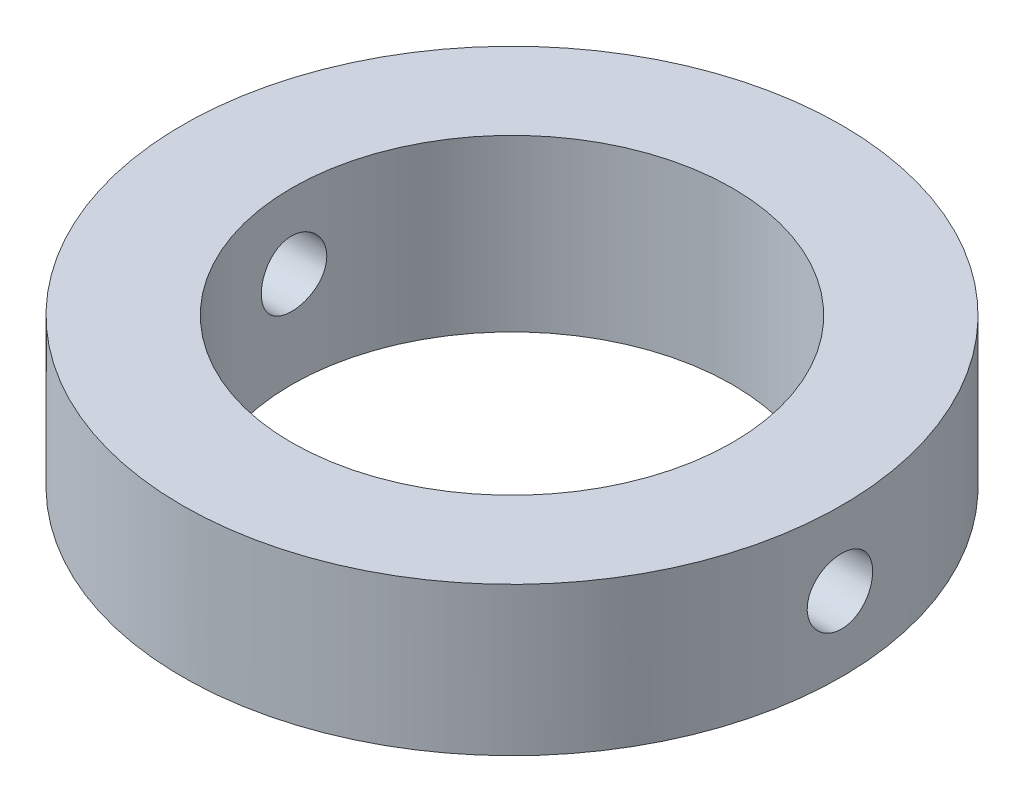
ISO-10303-21;
HEADER;
FILE_DESCRIPTION(('STEP AP214'),'2;1');
FILE_NAME('part.step','',(''),(''),'','','');
FILE_SCHEMA(('AUTOMOTIVE_DESIGN { 1 0 10303 214 1 1 1 1 }'));
ENDSEC;
DATA;
#1=APPLICATION_CONTEXT('core data for automotive mechanical design processes');
#2=APPLICATION_PROTOCOL_DEFINITION('international standard','automotive_design',2000,#1);
#3=PRODUCT_CONTEXT('',#1,'mechanical');
#4=PRODUCT('Part','Part','',(#3));
#5=PRODUCT_RELATED_PRODUCT_CATEGORY('part','',(#4));
#6=PRODUCT_DEFINITION_FORMATION('','',#4);
#7=PRODUCT_DEFINITION_CONTEXT('part definition',#1,'design');
#8=PRODUCT_DEFINITION('design','',#6,#7);
#9=PRODUCT_DEFINITION_SHAPE('','',#8);
#10=(LENGTH_UNIT() NAMED_UNIT(*) SI_UNIT(.MILLI.,.METRE.));
#11=(NAMED_UNIT(*) PLANE_ANGLE_UNIT() SI_UNIT($,.RADIAN.));
#12=(NAMED_UNIT(*) SI_UNIT($,.STERADIAN.) SOLID_ANGLE_UNIT());
#13=UNCERTAINTY_MEASURE_WITH_UNIT(LENGTH_MEASURE(1.E-05),#10,'distance_accuracy_value','');
#14=(GEOMETRIC_REPRESENTATION_CONTEXT(3) GLOBAL_UNCERTAINTY_ASSIGNED_CONTEXT((#13)) GLOBAL_UNIT_ASSIGNED_CONTEXT((#10,
#11,#12)) REPRESENTATION_CONTEXT('',''));
#15=CARTESIAN_POINT('',(0.,0.,0.));
#16=DIRECTION('',(0.,0.,1.));
#17=DIRECTION('',(1.,0.,0.));
#18=AXIS2_PLACEMENT_3D('',#15,#16,#17);
#19=CARTESIAN_POINT('',(0.,0.,0.));
#20=DIRECTION('',(0.,1.,0.));
#21=DIRECTION('',(0.,0.,1.));
#22=AXIS2_PLACEMENT_3D('',#19,#20,#21);
#23=PLANE('',#22);
#24=CARTESIAN_POINT('',(0.,0.,0.));
#25=DIRECTION('',(0.,1.,0.));
#26=DIRECTION('',(0.,0.,1.));
#27=AXIS2_PLACEMENT_3D('',#24,#25,#26);
#28=CIRCLE('',#27,10.1);
#29=CARTESIAN_POINT('',(0.,0.,10.1));
#30=VERTEX_POINT('',#29);
#31=EDGE_CURVE('E10',#30,#30,#28,.T.);
#32=ORIENTED_EDGE('',*,*,#31,.T.);
#33=EDGE_LOOP('',(#32));
#34=FACE_BOUND('',#33,.T.);
#35=CARTESIAN_POINT('',(0.,0.,0.));
#36=DIRECTION('',(0.,-1.,0.));
#37=DIRECTION('',(0.,0.,-1.));
#38=AXIS2_PLACEMENT_3D('',#35,#36,#37);
#39=CIRCLE('',#38,11.1);
#40=CARTESIAN_POINT('',(0.,0.,-11.1));
#41=VERTEX_POINT('',#40);
#42=EDGE_CURVE('E87',#41,#41,#39,.T.);
#43=ORIENTED_EDGE('',*,*,#42,.T.);
#44=EDGE_LOOP('',(#43));
#45=FACE_BOUND('',#44,.T.);
#46=ADVANCED_FACE('F37',(#34,#45),#23,.F.);
#47=CARTESIAN_POINT('',(0.,7.,0.));
#48=DIRECTION('',(0.,-1.,0.));
#49=DIRECTION('',(0.,0.,-1.));
#50=AXIS2_PLACEMENT_3D('',#47,#48,#49);
#51=CYLINDRICAL_SURFACE('',#50,15.1);
#52=CARTESIAN_POINT('',(15.0253119767944,4.40195198423839,-1.5));
#53=CARTESIAN_POINT('',(15.025312956074,4.31791964633027,-1.49999635854613));
#54=CARTESIAN_POINT('',(15.0260245276725,4.23383167514984,-1.49291478510042));
#55=CARTESIAN_POINT('',(15.028793551497,4.0679868973905,-1.46477185820528));
#56=CARTESIAN_POINT('',(15.03085248871,3.98623276690889,-1.44369507968879));
#57=CARTESIAN_POINT('',(15.0360807748948,3.82748138213704,-1.38818135253405));
#58=CARTESIAN_POINT('',(15.0392494524589,3.75048128465312,-1.35375248074173));
#59=CARTESIAN_POINT('',(15.0463393621317,3.60336947229937,-1.27252733745513));
#60=CARTESIAN_POINT('',(15.05026044424,3.53325638863079,-1.22573353035035));
#61=CARTESIAN_POINT('',(15.0584291270942,3.40164041138032,-1.12092628167147));
#62=CARTESIAN_POINT('',(15.0626777301768,3.34016571712225,-1.06287750232365));
#63=CARTESIAN_POINT('',(15.0710136412484,3.22781435660586,-0.937283575420638));
#64=CARTESIAN_POINT('',(15.0751009418651,3.17693817429363,-0.869737994461101));
#65=CARTESIAN_POINT('',(15.0826635983521,3.08713073995281,-0.726895315412325));
#66=CARTESIAN_POINT('',(15.0861376707466,3.04822441717046,-0.651582470180898));
#67=CARTESIAN_POINT('',(15.0920715347339,2.98362059666331,-0.495452469131729));
#68=CARTESIAN_POINT('',(15.0945313507482,2.95792278089715,-0.41463544589954));
#69=CARTESIAN_POINT('',(15.0981525138302,2.92054806968225,-0.25007588360048));
#70=CARTESIAN_POINT('',(15.0993181456551,2.90882489773051,-0.166343950618249));
#71=CARTESIAN_POINT('',(15.100234174601,2.89958907012991,0.00190655759438858));
#72=CARTESIAN_POINT('',(15.0999846079687,2.90207605052395,0.0864251126221069));
#73=CARTESIAN_POINT('',(15.0981018679929,2.92115235247668,0.253535560434278));
#74=CARTESIAN_POINT('',(15.0964735769364,2.93769191227861,0.33613319640171));
#75=CARTESIAN_POINT('',(15.0920219994832,2.98432635989481,0.497374352123938));
#76=CARTESIAN_POINT('',(15.0891986977396,3.01442142179542,0.576017821082986));
#77=CARTESIAN_POINT('',(15.0826661343107,3.08736718547543,0.727275160741127));
#78=CARTESIAN_POINT('',(15.0789553445811,3.13023991906992,0.799878337650498));
#79=CARTESIAN_POINT('',(15.0710642123586,3.22750802813828,0.936877465459626));
#80=CARTESIAN_POINT('',(15.0668838562791,3.28190373706343,1.00127317876582));
#81=CARTESIAN_POINT('',(15.0585014337633,3.40095358744894,1.12032085957513));
#82=CARTESIAN_POINT('',(15.054299351531,3.46565101468674,1.17492954862421));
#83=CARTESIAN_POINT('',(15.0463651004589,3.60331766831642,1.27251801061355));
#84=CARTESIAN_POINT('',(15.0426329322861,3.67628690644872,1.31549776704826));
#85=CARTESIAN_POINT('',(15.0360607178808,3.82845898932344,1.38860805601259));
#86=CARTESIAN_POINT('',(15.0332208560381,3.90766311824535,1.41873593323833));
#87=CARTESIAN_POINT('',(15.0287585753405,4.07004031690201,1.46525308871646));
#88=CARTESIAN_POINT('',(15.0271361198954,4.15321326727045,1.48164277988374));
#89=CARTESIAN_POINT('',(15.0252986591232,4.32078724792853,1.50016268663854));
#90=CARTESIAN_POINT('',(15.0250776785925,4.40518152482314,1.50235344042828));
#91=CARTESIAN_POINT('',(15.0260524182927,4.57313599453528,1.49257225368717));
#92=CARTESIAN_POINT('',(15.0272481196383,4.65669619845655,1.48060050195127));
#93=CARTESIAN_POINT('',(15.0309160596127,4.82043420810754,1.44288477969783));
#94=CARTESIAN_POINT('',(15.0333856461404,4.90061866812364,1.41716941799686));
#95=CARTESIAN_POINT('',(15.0393209391003,5.05553586045146,1.35272564260952));
#96=CARTESIAN_POINT('',(15.0427866680578,5.13026846943526,1.31399693465547));
#97=CARTESIAN_POINT('',(15.0503382064572,5.2724365564565,1.2244741127262));
#98=CARTESIAN_POINT('',(15.0544260614167,5.33984665708986,1.17363987299589));
#99=CARTESIAN_POINT('',(15.0627545443571,5.4651988946409,1.06140651663175));
#100=CARTESIAN_POINT('',(15.0669951760684,5.52314080016871,1.00000714187558));
#101=CARTESIAN_POINT('',(15.0751694218504,5.62812056327944,0.868123835144981));
#102=CARTESIAN_POINT('',(15.0791018911967,5.67511893532869,0.797608391658782));
#103=CARTESIAN_POINT('',(15.0862000664518,5.75660584011928,0.6496503296683));
#104=CARTESIAN_POINT('',(15.0893657827459,5.7910945423024,0.572207805008099));
#105=CARTESIAN_POINT('',(15.0945685839412,5.84651615705646,0.412731881610147));
#106=CARTESIAN_POINT('',(15.0966076555916,5.86747294317789,0.330706846940059));
#107=CARTESIAN_POINT('',(15.099335565752,5.89531375803699,0.164281005364227));
#108=CARTESIAN_POINT('',(15.1000244416734,5.90219817669277,0.0798802643504124));
#109=CARTESIAN_POINT('',(15.0999743264919,5.90169339191487,-0.0885132586038651));
#110=CARTESIAN_POINT('',(15.0992414683536,5.89436549647889,-0.172506232884099));
#111=CARTESIAN_POINT('',(15.096442335095,5.86577262333704,-0.338061727779914));
#112=CARTESIAN_POINT('',(15.0943760588904,5.84450763429833,-0.419624246419131));
#113=CARTESIAN_POINT('',(15.0891416171645,5.78866113304812,-0.578003288244199));
#114=CARTESIAN_POINT('',(15.0859735976019,5.75408138470768,-0.654820438508596));
#115=CARTESIAN_POINT('',(15.078888864656,5.67259351614709,-0.80156983757512));
#116=CARTESIAN_POINT('',(15.0749721559724,5.62568547331263,-0.871502129590261));
#117=CARTESIAN_POINT('',(15.0668086636542,5.52064265873991,-1.00281085394435));
#118=CARTESIAN_POINT('',(15.0625605816352,5.46246224856032,-1.06415069694839));
#119=CARTESIAN_POINT('',(15.0542241088092,5.3366159192252,-1.17622425255195));
#120=CARTESIAN_POINT('',(15.050135756584,5.26894772623825,-1.22695541540431));
#121=CARTESIAN_POINT('',(15.042570630608,5.12586092760086,-1.31647186691678));
#122=CARTESIAN_POINT('',(15.0390954200226,5.05042326722245,-1.35522680653065));
#123=CARTESIAN_POINT('',(15.0331686996374,4.89412493695957,-1.41946790711139));
#124=CARTESIAN_POINT('',(15.0307160348248,4.81327050609486,-1.444969046934));
#125=CARTESIAN_POINT('',(15.0277311589647,4.67695653567386,-1.47561362318629));
#126=CARTESIAN_POINT('',(15.0268282506956,4.62236870224172,-1.48474603116335));
#127=CARTESIAN_POINT('',(15.0256183386627,4.51251260087821,-1.49694040505908));
#128=CARTESIAN_POINT('',(15.0253113324391,4.45724433575661,-1.50000239603648));
#129=CARTESIAN_POINT('',(15.0253119767944,4.40195198423839,-1.5));
#130=B_SPLINE_CURVE_WITH_KNOTS('',3,(#52,#53,#54,#55,#56,#57,#58,#59,#60,#61,#62,#63,#64,#65,
#66,#67,#68,#69,#70,#71,#72,#73,#74,#75,#76,#77,#78,#79,#80,#81,#82,#83,#84,#85,#86,#87,#88,#89,
#90,#91,#92,#93,#94,#95,#96,#97,#98,#99,#100,#101,#102,#103,#104,#105,#106,#107,#108,#109,#110,
#111,#112,#113,#114,#115,#116,#117,#118,#119,#120,#121,#122,#123,#124,#125,#126,#127,#128,#129),
.UNSPECIFIED.,.T.,.F.,(4,2,2,2,2,2,2,2,2,2,2,2,2,2,2,2,2,2,2,2,2,2,2,2,2,2,2,2,2,2,2,2,2,2,2,2,
2,2,4),(0.,0.251895097196478,0.504068286960378,0.756089171389042,1.00805986471088,
1.26083488254586,1.51362143998952,1.76693095868191,2.02023437776912,2.27269664114698,
2.52515243837155,2.77671796950038,3.0282867314479,3.28029179364622,3.53230414935095,
3.78540479946109,4.03850580880848,4.29165908560717,4.54480475335871,4.79687040216311,
5.04893269081456,5.30047231646476,5.55201763050299,5.80440863162632,6.05680579992192,
6.310100003098,6.56339077531052,6.81623345189483,7.06906912260184,7.32081655553195,
7.57256419316887,7.82427849203736,8.07599121091296,8.32874517901133,8.5815598257125,
8.83500997565596,9.08817306120622,9.25391794111062,9.41966213681693),.UNSPECIFIED.);
#131=CARTESIAN_POINT('',(15.0253119767944,4.40195198423839,-1.5));
#132=VERTEX_POINT('',#131);
#133=EDGE_CURVE('E51',#132,#132,#130,.T.);
#134=ORIENTED_EDGE('',*,*,#133,.T.);
#135=EDGE_LOOP('',(#134));
#136=FACE_BOUND('',#135,.T.);
#137=CARTESIAN_POINT('',(-15.0253119767944,4.40195198423839,-1.5));
#138=CARTESIAN_POINT('',(-15.025312956074,4.48598432214651,-1.49999635854613));
#139=CARTESIAN_POINT('',(-15.0260245276725,4.57007229332695,-1.49291478510042));
#140=CARTESIAN_POINT('',(-15.028793551497,4.73591707108628,-1.46477185820528));
#141=CARTESIAN_POINT('',(-15.03085248871,4.81767120156789,-1.44369507968879));
#142=CARTESIAN_POINT('',(-15.0360807748948,4.97642258633974,-1.38818135253405));
#143=CARTESIAN_POINT('',(-15.0392494524589,5.05342268382366,-1.35375248074173));
#144=CARTESIAN_POINT('',(-15.0463393621317,5.20053449617741,-1.27252733745513));
#145=CARTESIAN_POINT('',(-15.05026044424,5.27064757984599,-1.22573353035035));
#146=CARTESIAN_POINT('',(-15.0584291270942,5.40226355709646,-1.12092628167147));
#147=CARTESIAN_POINT('',(-15.0626777301768,5.46373825135453,-1.06287750232365));
#148=CARTESIAN_POINT('',(-15.0710136412484,5.57608961187092,-0.937283575420636));
#149=CARTESIAN_POINT('',(-15.0751009418651,5.62696579418315,-0.869737994461099));
#150=CARTESIAN_POINT('',(-15.0826635983521,5.71677322852397,-0.726895315412323));
#151=CARTESIAN_POINT('',(-15.0861376707466,5.75567955130632,-0.651582470180896));
#152=CARTESIAN_POINT('',(-15.0920715347339,5.82028337181347,-0.495452469131727));
#153=CARTESIAN_POINT('',(-15.0945313507482,5.84598118757963,-0.414635445899539));
#154=CARTESIAN_POINT('',(-15.0981525138302,5.88335589879453,-0.250075883600478));
#155=CARTESIAN_POINT('',(-15.0993181456551,5.89507907074627,-0.166343950618247));
#156=CARTESIAN_POINT('',(-15.100234174601,5.90431489834687,0.00190655759439041));
#157=CARTESIAN_POINT('',(-15.0999846079687,5.90182791795283,0.0864251126221085));
#158=CARTESIAN_POINT('',(-15.0981018679929,5.8827516160001,0.25353556043428));
#159=CARTESIAN_POINT('',(-15.0964735769364,5.86621205619817,0.336133196401712));
#160=CARTESIAN_POINT('',(-15.0920219994832,5.81957760858197,0.49737435212394));
#161=CARTESIAN_POINT('',(-15.0891986977396,5.78948254668136,0.576017821082987));
#162=CARTESIAN_POINT('',(-15.0826661343107,5.71653678300135,0.727275160741129));
#163=CARTESIAN_POINT('',(-15.0789553445811,5.67366404940686,0.799878337650499));
#164=CARTESIAN_POINT('',(-15.0710642123586,5.5763959403385,0.936877465459627));
#165=CARTESIAN_POINT('',(-15.0668838562791,5.52200023141335,1.00127317876582));
#166=CARTESIAN_POINT('',(-15.0585014337633,5.40295038102784,1.12032085957513));
#167=CARTESIAN_POINT('',(-15.054299351531,5.33825295379004,1.17492954862421));
#168=CARTESIAN_POINT('',(-15.0463651004589,5.20058630016035,1.27251801061355));
#169=CARTESIAN_POINT('',(-15.0426329322861,5.12761706202806,1.31549776704826));
#170=CARTESIAN_POINT('',(-15.0360607178808,4.97544497915334,1.38860805601259));
#171=CARTESIAN_POINT('',(-15.0332208560381,4.89624085023143,1.41873593323833));
#172=CARTESIAN_POINT('',(-15.0287585753405,4.73386365157477,1.46525308871646));
#173=CARTESIAN_POINT('',(-15.0271361198954,4.65069070120633,1.48164277988374));
#174=CARTESIAN_POINT('',(-15.0252986591232,4.48311672054825,1.50016268663854));
#175=CARTESIAN_POINT('',(-15.0250776785925,4.39872244365364,1.50235344042828));
#176=CARTESIAN_POINT('',(-15.0260524182927,4.2307679739415,1.49257225368717));
#177=CARTESIAN_POINT('',(-15.0272481196383,4.14720777002023,1.48060050195127));
#178=CARTESIAN_POINT('',(-15.0309160596127,3.98346976036924,1.44288477969783));
#179=CARTESIAN_POINT('',(-15.0333856461404,3.90328530035314,1.41716941799686));
#180=CARTESIAN_POINT('',(-15.0393209391003,3.74836810802532,1.35272564260952));
#181=CARTESIAN_POINT('',(-15.0427866680578,3.67363549904151,1.31399693465547));
#182=CARTESIAN_POINT('',(-15.0503382064572,3.53146741202028,1.2244741127262));
#183=CARTESIAN_POINT('',(-15.0544260614167,3.46405731138692,1.17363987299589));
#184=CARTESIAN_POINT('',(-15.0627545443571,3.33870507383588,1.06140651663175));
#185=CARTESIAN_POINT('',(-15.0669951760684,3.28076316830807,1.00000714187558));
#186=CARTESIAN_POINT('',(-15.0751694218504,3.17578340519734,0.86812383514498));
#187=CARTESIAN_POINT('',(-15.0791018911967,3.12878503314809,0.797608391658782));
#188=CARTESIAN_POINT('',(-15.0862000664518,3.0472981283575,0.649650329668299));
#189=CARTESIAN_POINT('',(-15.0893657827459,3.01280942617438,0.572207805008098));
#190=CARTESIAN_POINT('',(-15.0945685839412,2.95738781142032,0.412731881610145));
#191=CARTESIAN_POINT('',(-15.0966076555916,2.93643102529889,0.330706846940057));
#192=CARTESIAN_POINT('',(-15.099335565752,2.90859021043979,0.164281005364225));
#193=CARTESIAN_POINT('',(-15.1000244416734,2.90170579178401,0.0798802643504102));
#194=CARTESIAN_POINT('',(-15.0999743264919,2.90221057656191,-0.0885132586038675));
#195=CARTESIAN_POINT('',(-15.0992414683536,2.90953847199789,-0.172506232884101));
#196=CARTESIAN_POINT('',(-15.096442335095,2.93813134513973,-0.338061727779916));
#197=CARTESIAN_POINT('',(-15.0943760588904,2.95939633417845,-0.419624246419133));
#198=CARTESIAN_POINT('',(-15.0891416171645,3.01524283542866,-0.578003288244202));
#199=CARTESIAN_POINT('',(-15.0859735976019,3.0498225837691,-0.654820438508598));
#200=CARTESIAN_POINT('',(-15.078888864656,3.13131045232969,-0.801569837575122));
#201=CARTESIAN_POINT('',(-15.0749721559724,3.17821849516415,-0.871502129590263));
#202=CARTESIAN_POINT('',(-15.0668086636542,3.28326130973687,-1.00281085394436));
#203=CARTESIAN_POINT('',(-15.0625605816352,3.34144171991646,-1.06415069694839));
#204=CARTESIAN_POINT('',(-15.0542241088092,3.46728804925158,-1.17622425255196));
#205=CARTESIAN_POINT('',(-15.050135756584,3.53495624223854,-1.22695541540431));
#206=CARTESIAN_POINT('',(-15.042570630608,3.67804304087593,-1.31647186691678));
#207=CARTESIAN_POINT('',(-15.0390954200226,3.75348070125433,-1.35522680653065));
#208=CARTESIAN_POINT('',(-15.0331686996374,3.90977903151721,-1.41946790711139));
#209=CARTESIAN_POINT('',(-15.0307160348248,3.99063346238193,-1.444969046934));
#210=CARTESIAN_POINT('',(-15.0277311589647,4.12694743280292,-1.47561362318629));
#211=CARTESIAN_POINT('',(-15.0268282506956,4.18153526623506,-1.48474603116335));
#212=CARTESIAN_POINT('',(-15.0256183386627,4.29139136759857,-1.49694040505908));
#213=CARTESIAN_POINT('',(-15.0253113324391,4.34665963272017,-1.50000239603648));
#214=CARTESIAN_POINT('',(-15.0253119767944,4.40195198423839,-1.5));
#215=B_SPLINE_CURVE_WITH_KNOTS('',3,(#137,#138,#139,#140,#141,#142,#143,#144,#145,#146,#147,
#148,#149,#150,#151,#152,#153,#154,#155,#156,#157,#158,#159,#160,#161,#162,#163,#164,#165,#166,
#167,#168,#169,#170,#171,#172,#173,#174,#175,#176,#177,#178,#179,#180,#181,#182,#183,#184,#185,
#186,#187,#188,#189,#190,#191,#192,#193,#194,#195,#196,#197,#198,#199,#200,#201,#202,#203,#204,
#205,#206,#207,#208,#209,#210,#211,#212,#213,#214),.UNSPECIFIED.,.T.,.F.,(4,2,2,2,2,2,2,2,2,2,2,
2,2,2,2,2,2,2,2,2,2,2,2,2,2,2,2,2,2,2,2,2,2,2,2,2,2,2,4),(0.,0.251895097196478,
0.504068286960379,0.756089171389043,1.00805986471088,1.26083488254586,1.51362143998953,
1.76693095868191,2.02023437776912,2.27269664114698,2.52515243837155,2.77671796950038,
3.02828673144791,3.28029179364622,3.53230414935095,3.78540479946109,4.03850580880848,
4.29165908560717,4.54480475335871,4.79687040216311,5.04893269081456,5.30047231646476,
5.55201763050299,5.80440863162632,6.05680579992192,6.310100003098,6.56339077531052,
6.81623345189483,7.06906912260184,7.32081655553195,7.57256419316887,7.82427849203736,
8.07599121091296,8.32874517901134,8.5815598257125,8.83500997565595,9.08817306120622,
9.25391794111061,9.41966213681693),.UNSPECIFIED.);
#216=CARTESIAN_POINT('',(-15.0253119767944,4.40195198423839,-1.5));
#217=VERTEX_POINT('',#216);
#218=EDGE_CURVE('E46',#217,#217,#215,.T.);
#219=ORIENTED_EDGE('',*,*,#218,.T.);
#220=EDGE_LOOP('',(#219));
#221=FACE_BOUND('',#220,.T.);
#222=CARTESIAN_POINT('',(0.,1.,0.));
#223=DIRECTION('',(0.,-1.,0.));
#224=DIRECTION('',(0.,0.,-1.));
#225=AXIS2_PLACEMENT_3D('',#222,#223,#224);
#226=CIRCLE('',#225,15.1);
#227=CARTESIAN_POINT('',(0.,1.,-15.1));
#228=VERTEX_POINT('',#227);
#229=EDGE_CURVE('E42',#228,#228,#226,.T.);
#230=ORIENTED_EDGE('',*,*,#229,.F.);
#231=EDGE_LOOP('',(#230));
#232=FACE_BOUND('',#231,.T.);
#233=CARTESIAN_POINT('',(0.,7.8,0.));
#234=DIRECTION('',(0.,1.,0.));
#235=DIRECTION('',(0.,0.,1.));
#236=AXIS2_PLACEMENT_3D('',#233,#234,#235);
#237=CIRCLE('',#236,15.1);
#238=CARTESIAN_POINT('',(0.,7.8,15.1));
#239=VERTEX_POINT('',#238);
#240=EDGE_CURVE('E91',#239,#239,#237,.T.);
#241=ORIENTED_EDGE('',*,*,#240,.F.);
#242=EDGE_LOOP('',(#241));
#243=FACE_BOUND('',#242,.T.);
#244=ADVANCED_FACE('F39',(#136,#221,#232,#243),#51,.T.);
#245=CARTESIAN_POINT('',(0.,7.,0.));
#246=DIRECTION('',(0.,-1.,0.));
#247=DIRECTION('',(0.,0.,-1.));
#248=AXIS2_PLACEMENT_3D('',#245,#246,#247);
#249=CYLINDRICAL_SURFACE('',#248,10.1);
#250=CARTESIAN_POINT('',(-9.98799279134702,4.40195198423839,-1.5));
#251=CARTESIAN_POINT('',(-9.9879941807315,4.48570763547156,-1.49999653344231));
#252=CARTESIAN_POINT('',(-9.98905770648355,4.56951214599991,-1.49296127254229));
#253=CARTESIAN_POINT('',(-9.99319409703962,4.73477877718815,-1.4650131891143));
#254=CARTESIAN_POINT('',(-9.9962689306879,4.81623852092922,-1.4440867684053));
#255=CARTESIAN_POINT('',(-10.0040721668359,4.97439946296953,-1.38899565010733));
#256=CARTESIAN_POINT('',(-10.0087993095095,5.05110423445139,-1.3548410364022));
#257=CARTESIAN_POINT('',(-10.0193730361715,5.19768294899213,-1.27428666965844));
#258=CARTESIAN_POINT('',(-10.0252194636316,5.26755784512593,-1.22788862848153));
#259=CARTESIAN_POINT('',(-10.0374243377324,5.39905292085368,-1.12377540451144));
#260=CARTESIAN_POINT('',(-10.0437860907059,5.46061170731654,-1.06598306009875));
#261=CARTESIAN_POINT('',(-10.0562752827391,5.57319522147792,-0.940888332795035));
#262=CARTESIAN_POINT('',(-10.062402708982,5.62421937364223,-0.873585430655924));
#263=CARTESIAN_POINT('',(-10.0737674010683,5.71451137641762,-0.730987203197165));
#264=CARTESIAN_POINT('',(-10.0790003404198,5.75372274997111,-0.655655742883641));
#265=CARTESIAN_POINT('',(-10.0879498450303,5.81891374084655,-0.499385477087391));
#266=CARTESIAN_POINT('',(-10.091666488864,5.84489404382197,-0.418446962417423));
#267=CARTESIAN_POINT('',(-10.0971413144263,5.88269945862139,-0.253892161972046));
#268=CARTESIAN_POINT('',(-10.0989137078675,5.89462733634312,-0.170299966480004));
#269=CARTESIAN_POINT('',(-10.1003490286794,5.90430836816992,-0.00228305764693237));
#270=CARTESIAN_POINT('',(-10.1000120711155,5.90206229546559,0.0821416100318043));
#271=CARTESIAN_POINT('',(-10.0972780203372,5.88354036396603,0.248725950780092));
#272=CARTESIAN_POINT('',(-10.094897161874,5.86737506288026,0.330898220633102));
#273=CARTESIAN_POINT('',(-10.088360916662,5.82164704247938,0.491350729660536));
#274=CARTESIAN_POINT('',(-10.0842054849745,5.79208398388351,0.569630870216145));
#275=CARTESIAN_POINT('',(-10.0745590881838,5.72028617219418,0.720412155832024));
#276=CARTESIAN_POINT('',(-10.0690632232448,5.67800479299938,0.792890772625558));
#277=CARTESIAN_POINT('',(-10.0573486227851,5.58200458705109,0.929765956778823));
#278=CARTESIAN_POINT('',(-10.051129840617,5.52828502204214,0.994162002038075));
#279=CARTESIAN_POINT('',(-10.03859232388,5.41031724033158,1.11369563859232));
#280=CARTESIAN_POINT('',(-10.0322732037026,5.34597250826839,1.1687379815968));
#281=CARTESIAN_POINT('',(-10.0203057456663,5.2089090486257,1.26725821808431));
#282=CARTESIAN_POINT('',(-10.0146574117855,5.13619027138932,1.31073604298635));
#283=CARTESIAN_POINT('',(-10.0046711709491,4.98434458502124,1.38490545914184));
#284=CARTESIAN_POINT('',(-10.000334253838,4.90521289232217,1.41558739877766));
#285=CARTESIAN_POINT('',(-9.99347951155194,4.74284086866334,1.46319899968337));
#286=CARTESIAN_POINT('',(-9.99096156082662,4.65960082169808,1.48012961012051));
#287=CARTESIAN_POINT('',(-9.98805360190675,4.49222200773893,1.49962761276662));
#288=CARTESIAN_POINT('',(-9.9876436002483,4.40809929726599,1.50232996303392));
#289=CARTESIAN_POINT('',(-9.98894489300218,4.24060218384308,1.49365271180531));
#290=CARTESIAN_POINT('',(-9.99065612293453,4.15722775822478,1.48227353835142));
#291=CARTESIAN_POINT('',(-9.99598870786081,3.99401113496763,1.44587066238782));
#292=CARTESIAN_POINT('',(-9.99960066436801,3.91415363434963,1.42091407548796));
#293=CARTESIAN_POINT('',(-10.0083199834493,3.75975536017499,1.3581345672902));
#294=CARTESIAN_POINT('',(-10.0134274185329,3.68521484463503,1.32031102211212));
#295=CARTESIAN_POINT('',(-10.0246093694854,3.5429611335953,1.23254652968968));
#296=CARTESIAN_POINT('',(-10.0306907495831,3.47530243105456,1.18251814675273));
#297=CARTESIAN_POINT('',(-10.0431146428354,3.34929283747603,1.07188578120655));
#298=CARTESIAN_POINT('',(-10.0494571704408,3.29094246239906,1.0112812127487));
#299=CARTESIAN_POINT('',(-10.0617511338477,3.18472187784647,0.880622772605111));
#300=CARTESIAN_POINT('',(-10.0676989565668,3.13694105915837,0.810495839364269));
#301=CARTESIAN_POINT('',(-10.0784773442146,3.05383843093372,0.663132492509456));
#302=CARTESIAN_POINT('',(-10.0833079392147,3.01851628604455,0.585896270328215));
#303=CARTESIAN_POINT('',(-10.091291750582,2.96147680961263,0.426787036624583));
#304=CARTESIAN_POINT('',(-10.0944510086439,2.93971042422909,0.344931926490835));
#305=CARTESIAN_POINT('',(-10.0987615273987,2.91024152620122,0.178678114676163));
#306=CARTESIAN_POINT('',(-10.0999129179848,2.90253810379265,0.0942795778942369));
#307=CARTESIAN_POINT('',(-10.1000767141153,2.901435673647,-0.0737979593676887));
#308=CARTESIAN_POINT('',(-10.0991095821349,2.90789982389071,-0.157476074593946));
#309=CARTESIAN_POINT('',(-10.0951862237568,2.93465595574083,-0.322541533858875));
#310=CARTESIAN_POINT('',(-10.0922300033599,2.95494789563196,-0.403928884807487));
#311=CARTESIAN_POINT('',(-10.0846590903396,3.00873539360917,-0.562066195806303));
#312=CARTESIAN_POINT('',(-10.0800455648914,3.04222166104974,-0.638819375198151));
#313=CARTESIAN_POINT('',(-10.069667038128,3.12143270157356,-0.785639125019115));
#314=CARTESIAN_POINT('',(-10.0639020009153,3.16715785620921,-0.855705486891521));
#315=CARTESIAN_POINT('',(-10.0517952900267,3.27004427454951,-0.987857096280018));
#316=CARTESIAN_POINT('',(-10.0454488102282,3.32730663310734,-1.0498632033418));
#317=CARTESIAN_POINT('',(-10.0329302424009,3.45142934812149,-1.1634362846356));
#318=CARTESIAN_POINT('',(-10.0267581956683,3.51829195498087,-1.21500080439535));
#319=CARTESIAN_POINT('',(-10.0152509195948,3.66014916420054,-1.30648105394677));
#320=CARTESIAN_POINT('',(-10.0099204805119,3.73518647859144,-1.34633114128171));
#321=CARTESIAN_POINT('',(-10.000756103769,3.8909325570713,-1.41280326563462));
#322=CARTESIAN_POINT('',(-9.99692060915421,3.97163531674393,-1.43943907299511));
#323=CARTESIAN_POINT('',(-9.99206944883039,4.11091216598047,-1.47266011989249));
#324=CARTESIAN_POINT('',(-9.99054877580241,4.16862477266443,-1.48289694940458));
#325=CARTESIAN_POINT('',(-9.98850996769776,4.28486762784505,-1.49656805845126));
#326=CARTESIAN_POINT('',(-9.98799182001933,4.34339786605476,-1.50000242349293));
#327=CARTESIAN_POINT('',(-9.98799279134702,4.40195198423839,-1.5));
#328=B_SPLINE_CURVE_WITH_KNOTS('',3,(#250,#251,#252,#253,#254,#255,#256,#257,#258,#259,#260,
#261,#262,#263,#264,#265,#266,#267,#268,#269,#270,#271,#272,#273,#274,#275,#276,#277,#278,#279,
#280,#281,#282,#283,#284,#285,#286,#287,#288,#289,#290,#291,#292,#293,#294,#295,#296,#297,#298,
#299,#300,#301,#302,#303,#304,#305,#306,#307,#308,#309,#310,#311,#312,#313,#314,#315,#316,#317,
#318,#319,#320,#321,#322,#323,#324,#325,#326,#327),.UNSPECIFIED.,.T.,.F.,(4,2,2,2,2,2,2,2,2,2,2,
2,2,2,2,2,2,2,2,2,2,2,2,2,2,2,2,2,2,2,2,2,2,2,2,2,2,2,4),(0.,0.251052939289683,
0.502351999686482,0.75345987004948,1.0045326493895,1.25736800199838,1.51021716400056,
1.76425668667206,2.01828304330335,2.27043993132932,2.52258306428745,2.77274175588819,
3.02290678278592,3.27400034429635,3.52511011706742,3.77864088688003,4.03217316017107,
4.28589632218244,4.53960196980048,4.79089677283443,5.04218393734158,5.29224008330331,
5.54230835546528,5.79422363077425,6.04615286490503,6.30013756263746,6.55411542329112,
6.80716879835763,7.06020580226047,7.31080954721575,7.56141253616008,7.81183938011411,
8.06227403213844,8.31500684097344,8.56779899015402,8.82198179176443,9.0758991551367,
9.25141409706726,9.42692683275827),.UNSPECIFIED.);
#329=CARTESIAN_POINT('',(-9.98799279134702,4.40195198423839,-1.5));
#330=VERTEX_POINT('',#329);
#331=EDGE_CURVE('E65',#330,#330,#328,.T.);
#332=ORIENTED_EDGE('',*,*,#331,.F.);
#333=EDGE_LOOP('',(#332));
#334=FACE_BOUND('',#333,.T.);
#335=CARTESIAN_POINT('',(9.98799279134702,4.40195198423839,-1.5));
#336=CARTESIAN_POINT('',(9.9879941807315,4.31819633300522,-1.49999653344231));
#337=CARTESIAN_POINT('',(9.98905770648355,4.23439182247687,-1.49296127254229));
#338=CARTESIAN_POINT('',(9.99319409703962,4.06912519128863,-1.4650131891143));
#339=CARTESIAN_POINT('',(9.9962689306879,3.98766544754756,-1.4440867684053));
#340=CARTESIAN_POINT('',(10.0040721668359,3.82950450550725,-1.38899565010733));
#341=CARTESIAN_POINT('',(10.0087993095095,3.75279973402539,-1.3548410364022));
#342=CARTESIAN_POINT('',(10.0193730361715,3.60622101948465,-1.27428666965844));
#343=CARTESIAN_POINT('',(10.0252194636316,3.53634612335085,-1.22788862848153));
#344=CARTESIAN_POINT('',(10.0374243377324,3.4048510476231,-1.12377540451144));
#345=CARTESIAN_POINT('',(10.0437860907059,3.34329226116024,-1.06598306009875));
#346=CARTESIAN_POINT('',(10.0562752827391,3.23070874699886,-0.940888332795035));
#347=CARTESIAN_POINT('',(10.062402708982,3.17968459483455,-0.873585430655924));
#348=CARTESIAN_POINT('',(10.0737674010683,3.08939259205916,-0.730987203197165));
#349=CARTESIAN_POINT('',(10.0790003404198,3.05018121850567,-0.655655742883641));
#350=CARTESIAN_POINT('',(10.0879498450303,2.98499022763023,-0.499385477087391));
#351=CARTESIAN_POINT('',(10.091666488864,2.95900992465481,-0.418446962417423));
#352=CARTESIAN_POINT('',(10.0971413144263,2.92120450985538,-0.253892161972046));
#353=CARTESIAN_POINT('',(10.0989137078675,2.90927663213366,-0.170299966480004));
#354=CARTESIAN_POINT('',(10.1003490286794,2.89959560030686,-0.00228305764693268));
#355=CARTESIAN_POINT('',(10.1000120711155,2.90184167301119,0.082141610031804));
#356=CARTESIAN_POINT('',(10.0972780203372,2.92036360451075,0.248725950780092));
#357=CARTESIAN_POINT('',(10.094897161874,2.93652890559652,0.330898220633102));
#358=CARTESIAN_POINT('',(10.088360916662,2.9822569259974,0.491350729660536));
#359=CARTESIAN_POINT('',(10.0842054849745,3.01181998459327,0.569630870216145));
#360=CARTESIAN_POINT('',(10.0745590881838,3.0836177962826,0.720412155832024));
#361=CARTESIAN_POINT('',(10.0690632232448,3.1258991754774,0.792890772625558));
#362=CARTESIAN_POINT('',(10.0573486227851,3.22189938142569,0.929765956778823));
#363=CARTESIAN_POINT('',(10.051129840617,3.27561894643464,0.994162002038075));
#364=CARTESIAN_POINT('',(10.03859232388,3.3935867281452,1.11369563859232));
#365=CARTESIAN_POINT('',(10.0322732037026,3.45793146020839,1.1687379815968));
#366=CARTESIAN_POINT('',(10.0203057456663,3.59499491985108,1.26725821808431));
#367=CARTESIAN_POINT('',(10.0146574117855,3.66771369708746,1.31073604298635));
#368=CARTESIAN_POINT('',(10.0046711709491,3.81955938345554,1.38490545914184));
#369=CARTESIAN_POINT('',(10.000334253838,3.89869107615461,1.41558739877766));
#370=CARTESIAN_POINT('',(9.99347951155194,4.06106309981344,1.46319899968337));
#371=CARTESIAN_POINT('',(9.99096156082662,4.1443031467787,1.48012961012051));
#372=CARTESIAN_POINT('',(9.98805360190675,4.31168196073785,1.49962761276662));
#373=CARTESIAN_POINT('',(9.9876436002483,4.39580467121079,1.50232996303392));
#374=CARTESIAN_POINT('',(9.98894489300218,4.5633017846337,1.49365271180531));
#375=CARTESIAN_POINT('',(9.99065612293453,4.646676210252,1.48227353835142));
#376=CARTESIAN_POINT('',(9.99598870786081,4.80989283350915,1.44587066238782));
#377=CARTESIAN_POINT('',(9.99960066436801,4.88975033412715,1.42091407548796));
#378=CARTESIAN_POINT('',(10.0083199834493,5.04414860830179,1.3581345672902));
#379=CARTESIAN_POINT('',(10.0134274185329,5.11868912384175,1.32031102211212));
#380=CARTESIAN_POINT('',(10.0246093694854,5.26094283488148,1.23254652968968));
#381=CARTESIAN_POINT('',(10.0306907495831,5.32860153742222,1.18251814675273));
#382=CARTESIAN_POINT('',(10.0431146428354,5.45461113100075,1.07188578120655));
#383=CARTESIAN_POINT('',(10.0494571704408,5.51296150607772,1.0112812127487));
#384=CARTESIAN_POINT('',(10.0617511338477,5.61918209063031,0.880622772605111));
#385=CARTESIAN_POINT('',(10.0676989565668,5.66696290931841,0.810495839364269));
#386=CARTESIAN_POINT('',(10.0784773442146,5.75006553754306,0.663132492509456));
#387=CARTESIAN_POINT('',(10.0833079392147,5.78538768243223,0.585896270328216));
#388=CARTESIAN_POINT('',(10.091291750582,5.84242715886415,0.426787036624584));
#389=CARTESIAN_POINT('',(10.0944510086439,5.86419354424769,0.344931926490836));
#390=CARTESIAN_POINT('',(10.0987615273987,5.89366244227556,0.178678114676163));
#391=CARTESIAN_POINT('',(10.0999129179848,5.90136586468413,0.094279577894237));
#392=CARTESIAN_POINT('',(10.1000767141153,5.90246829482978,-0.0737979593676886));
#393=CARTESIAN_POINT('',(10.0991095821349,5.89600414458607,-0.157476074593946));
#394=CARTESIAN_POINT('',(10.0951862237568,5.86924801273595,-0.322541533858874));
#395=CARTESIAN_POINT('',(10.0922300033599,5.84895607284482,-0.403928884807487));
#396=CARTESIAN_POINT('',(10.0846590903396,5.79516857486761,-0.562066195806302));
#397=CARTESIAN_POINT('',(10.0800455648914,5.76168230742704,-0.638819375198151));
#398=CARTESIAN_POINT('',(10.069667038128,5.68247126690322,-0.785639125019114));
#399=CARTESIAN_POINT('',(10.0639020009153,5.63674611226757,-0.855705486891521));
#400=CARTESIAN_POINT('',(10.0517952900267,5.53385969392727,-0.987857096280017));
#401=CARTESIAN_POINT('',(10.0454488102282,5.47659733536944,-1.0498632033418));
#402=CARTESIAN_POINT('',(10.0329302424009,5.35247462035529,-1.1634362846356));
#403=CARTESIAN_POINT('',(10.0267581956683,5.28561201349591,-1.21500080439535));
#404=CARTESIAN_POINT('',(10.0152509195948,5.14375480427624,-1.30648105394677));
#405=CARTESIAN_POINT('',(10.0099204805119,5.06871748988534,-1.34633114128171));
#406=CARTESIAN_POINT('',(10.000756103769,4.91297141140548,-1.41280326563462));
#407=CARTESIAN_POINT('',(9.99692060915421,4.83226865173285,-1.43943907299511));
#408=CARTESIAN_POINT('',(9.99206944883039,4.69299180249631,-1.47266011989249));
#409=CARTESIAN_POINT('',(9.99054877580241,4.63527919581235,-1.48289694940458));
#410=CARTESIAN_POINT('',(9.98850996769776,4.51903634063173,-1.49656805845126));
#411=CARTESIAN_POINT('',(9.98799182001933,4.46050610242202,-1.50000242349293));
#412=CARTESIAN_POINT('',(9.98799279134702,4.40195198423839,-1.5));
#413=B_SPLINE_CURVE_WITH_KNOTS('',3,(#335,#336,#337,#338,#339,#340,#341,#342,#343,#344,#345,
#346,#347,#348,#349,#350,#351,#352,#353,#354,#355,#356,#357,#358,#359,#360,#361,#362,#363,#364,
#365,#366,#367,#368,#369,#370,#371,#372,#373,#374,#375,#376,#377,#378,#379,#380,#381,#382,#383,
#384,#385,#386,#387,#388,#389,#390,#391,#392,#393,#394,#395,#396,#397,#398,#399,#400,#401,#402,
#403,#404,#405,#406,#407,#408,#409,#410,#411,#412),.UNSPECIFIED.,.T.,.F.,(4,2,2,2,2,2,2,2,2,2,2,
2,2,2,2,2,2,2,2,2,2,2,2,2,2,2,2,2,2,2,2,2,2,2,2,2,2,2,4),(0.,0.251052939289683,
0.502351999686482,0.75345987004948,1.0045326493895,1.25736800199838,1.51021716400056,
1.76425668667206,2.01828304330335,2.27043993132932,2.52258306428745,2.77274175588819,
3.02290678278592,3.27400034429635,3.52511011706741,3.77864088688003,4.03217316017107,
4.28589632218244,4.53960196980048,4.79089677283443,5.04218393734158,5.2922400833033,
5.54230835546528,5.79422363077425,6.04615286490503,6.30013756263746,6.55411542329112,
6.80716879835763,7.06020580226047,7.31080954721575,7.56141253616008,7.81183938011411,
8.06227403213844,8.31500684097344,8.56779899015402,8.82198179176443,9.0758991551367,
9.25141409706726,9.42692683275827),.UNSPECIFIED.);
#414=CARTESIAN_POINT('',(9.98799279134702,4.40195198423839,-1.5));
#415=VERTEX_POINT('',#414);
#416=EDGE_CURVE('E59',#415,#415,#413,.T.);
#417=ORIENTED_EDGE('',*,*,#416,.F.);
#418=EDGE_LOOP('',(#417));
#419=FACE_BOUND('',#418,.T.);
#420=ORIENTED_EDGE('',*,*,#31,.F.);
#421=EDGE_LOOP('',(#420));
#422=FACE_BOUND('',#421,.T.);
#423=CARTESIAN_POINT('',(0.,7.8,0.));
#424=DIRECTION('',(0.,1.,0.));
#425=DIRECTION('',(0.,0.,1.));
#426=AXIS2_PLACEMENT_3D('',#423,#424,#425);
#427=CIRCLE('',#426,10.1);
#428=CARTESIAN_POINT('',(0.,7.8,10.1));
#429=VERTEX_POINT('',#428);
#430=EDGE_CURVE('E96',#429,#429,#427,.T.);
#431=ORIENTED_EDGE('',*,*,#430,.T.);
#432=EDGE_LOOP('',(#431));
#433=FACE_BOUND('',#432,.T.);
#434=ADVANCED_FACE('F69',(#334,#419,#422,#433),#249,.F.);
#435=CARTESIAN_POINT('',(-24.,4.40195198423839,0.));
#436=DIRECTION('',(1.,0.,0.));
#437=DIRECTION('',(0.,0.,-1.));
#438=AXIS2_PLACEMENT_3D('',#435,#436,#437);
#439=CYLINDRICAL_SURFACE('',#438,1.5);
#440=ORIENTED_EDGE('',*,*,#416,.T.);
#441=EDGE_LOOP('',(#440));
#442=FACE_BOUND('',#441,.T.);
#443=ORIENTED_EDGE('',*,*,#133,.F.);
#444=EDGE_LOOP('',(#443));
#445=FACE_BOUND('',#444,.T.);
#446=ADVANCED_FACE('F76',(#442,#445),#439,.F.);
#447=ORIENTED_EDGE('',*,*,#331,.T.);
#448=EDGE_LOOP('',(#447));
#449=FACE_BOUND('',#448,.T.);
#450=ORIENTED_EDGE('',*,*,#218,.F.);
#451=EDGE_LOOP('',(#450));
#452=FACE_BOUND('',#451,.T.);
#453=ADVANCED_FACE('F71',(#449,#452),#439,.F.);
#454=CARTESIAN_POINT('',(0.,1.,0.));
#455=DIRECTION('',(0.,-1.,0.));
#456=DIRECTION('',(0.,0.,-1.));
#457=AXIS2_PLACEMENT_3D('',#454,#455,#456);
#458=PLANE('',#457);
#459=CARTESIAN_POINT('',(0.,1.,0.));
#460=DIRECTION('',(0.,-1.,0.));
#461=DIRECTION('',(0.,0.,-1.));
#462=AXIS2_PLACEMENT_3D('',#459,#460,#461);
#463=CIRCLE('',#462,11.1);
#464=CARTESIAN_POINT('',(0.,1.,-11.1));
#465=VERTEX_POINT('',#464);
#466=EDGE_CURVE('E90',#465,#465,#463,.T.);
#467=ORIENTED_EDGE('',*,*,#466,.F.);
#468=EDGE_LOOP('',(#467));
#469=FACE_BOUND('',#468,.T.);
#470=ORIENTED_EDGE('',*,*,#229,.T.);
#471=EDGE_LOOP('',(#470));
#472=FACE_BOUND('',#471,.T.);
#473=ADVANCED_FACE('F75',(#469,#472),#458,.T.);
#474=CARTESIAN_POINT('',(0.,1.,0.));
#475=DIRECTION('',(0.,-1.,0.));
#476=DIRECTION('',(0.,0.,-1.));
#477=AXIS2_PLACEMENT_3D('',#474,#475,#476);
#478=CYLINDRICAL_SURFACE('',#477,11.1);
#479=ORIENTED_EDGE('',*,*,#466,.T.);
#480=EDGE_LOOP('',(#479));
#481=FACE_BOUND('',#480,.T.);
#482=ORIENTED_EDGE('',*,*,#42,.F.);
#483=EDGE_LOOP('',(#482));
#484=FACE_BOUND('',#483,.T.);
#485=ADVANCED_FACE('F103',(#481,#484),#478,.T.);
#486=CARTESIAN_POINT('',(0.,7.8,0.));
#487=DIRECTION('',(0.,1.,0.));
#488=DIRECTION('',(0.,0.,1.));
#489=AXIS2_PLACEMENT_3D('',#486,#487,#488);
#490=PLANE('',#489);
#491=ORIENTED_EDGE('',*,*,#240,.T.);
#492=EDGE_LOOP('',(#491));
#493=FACE_BOUND('',#492,.T.);
#494=ORIENTED_EDGE('',*,*,#430,.F.);
#495=EDGE_LOOP('',(#494));
#496=FACE_BOUND('',#495,.T.);
#497=ADVANCED_FACE('F101',(#493,#496),#490,.T.);
#498=CLOSED_SHELL('',(#46,#244,#434,#446,#453,#473,#485,#497));
#499=MANIFOLD_SOLID_BREP('B2',#498);
#500=ADVANCED_BREP_SHAPE_REPRESENTATION('',(#18,#499),#14);
#501=SHAPE_DEFINITION_REPRESENTATION(#9,#500);
ENDSEC;
END-ISO-10303-21;
